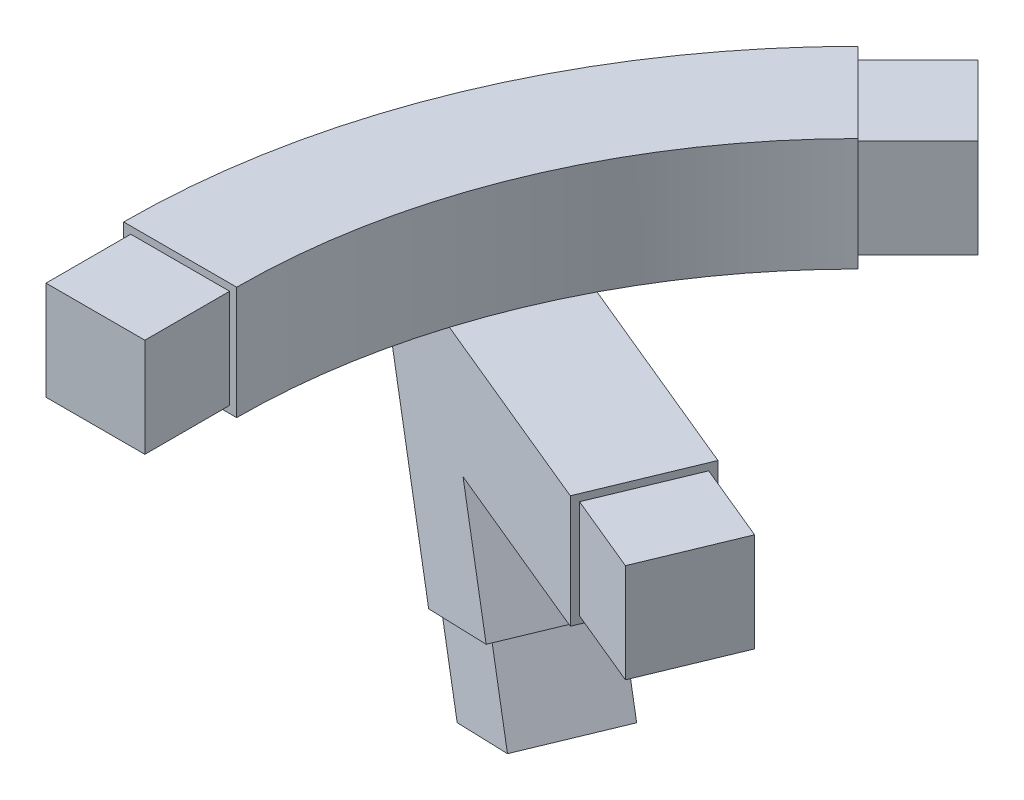
ISO-10303-21;
HEADER;
FILE_DESCRIPTION(('STEP AP214'),'2;1');
FILE_NAME('part.step','',(''),(''),'','','');
FILE_SCHEMA(('AUTOMOTIVE_DESIGN { 1 0 10303 214 1 1 1 1 }'));
ENDSEC;
DATA;
#1=APPLICATION_CONTEXT('core data for automotive mechanical design processes');
#2=APPLICATION_PROTOCOL_DEFINITION('international standard','automotive_design',2000,#1);
#3=PRODUCT_CONTEXT('',#1,'mechanical');
#4=PRODUCT('Part','Part','',(#3));
#5=PRODUCT_RELATED_PRODUCT_CATEGORY('part','',(#4));
#6=PRODUCT_DEFINITION_FORMATION('','',#4);
#7=PRODUCT_DEFINITION_CONTEXT('part definition',#1,'design');
#8=PRODUCT_DEFINITION('design','',#6,#7);
#9=PRODUCT_DEFINITION_SHAPE('','',#8);
#10=(LENGTH_UNIT() NAMED_UNIT(*) SI_UNIT(.MILLI.,.METRE.));
#11=(NAMED_UNIT(*) PLANE_ANGLE_UNIT() SI_UNIT($,.RADIAN.));
#12=(NAMED_UNIT(*) SI_UNIT($,.STERADIAN.) SOLID_ANGLE_UNIT());
#13=UNCERTAINTY_MEASURE_WITH_UNIT(LENGTH_MEASURE(1.E-05),#10,'distance_accuracy_value','');
#14=(GEOMETRIC_REPRESENTATION_CONTEXT(3) GLOBAL_UNCERTAINTY_ASSIGNED_CONTEXT((#13)) GLOBAL_UNIT_ASSIGNED_CONTEXT((#10,
#11,#12)) REPRESENTATION_CONTEXT('',''));
#15=CARTESIAN_POINT('',(0.,0.,0.));
#16=DIRECTION('',(0.,0.,1.));
#17=DIRECTION('',(1.,0.,0.));
#18=AXIS2_PLACEMENT_3D('',#15,#16,#17);
#19=CARTESIAN_POINT('',(-441.133726438275,-171.873730133986,-168.9771913672));
#20=DIRECTION('',(0.868162779195994,0.342020143325666,0.359604797490493));
#21=DIRECTION('',(0.382683432365084,0.,-0.923879532511289));
#22=AXIS2_PLACEMENT_3D('',#19,#20,#21);
#23=PLANE('',#22);
#24=CARTESIAN_POINT('',(-337.265634663522,-466.308521951962,-139.7));
#25=DIRECTION('',(0.868162779195994,0.342020143325666,0.359604797490493));
#26=DIRECTION('',(-0.315985410125161,0.939692620785909,-0.130885442385864));
#27=AXIS2_PLACEMENT_3D('',#24,#25,#26);
#28=ELLIPSE('',#27,482.720106466929,165.1);
#29=CARTESIAN_POINT('',(-484.486116716494,-14.0440282044672,-214.427101269156));
#30=VERTEX_POINT('',#29);
#31=CARTESIAN_POINT('',(-494.206275898566,-14.044028204468,-190.960561143369));
#32=VERTEX_POINT('',#31);
#33=EDGE_CURVE('E47',#30,#32,#28,.T.);
#34=ORIENTED_EDGE('',*,*,#33,.F.);
#35=DIRECTION('',(0.315985410125161,-0.939692620785909,0.130885442385864));
#36=VECTOR('',#35,1.);
#37=CARTESIAN_POINT('',(-431.413567256202,-171.873730133986,-192.443731492987));
#38=LINE('',#37,#36);
#39=CARTESIAN_POINT('',(-468.886007055742,-60.4363851359242,-207.965324273165));
#40=VERTEX_POINT('',#39);
#41=EDGE_CURVE('E219',#30,#40,#38,.T.);
#42=ORIENTED_EDGE('',*,*,#41,.T.);
#43=DIRECTION('',(0.382683432365084,0.,-0.923879532511289));
#44=VECTOR('',#43,1.);
#45=CARTESIAN_POINT('',(-478.606166237815,-60.4363851359242,-184.498784147378));
#46=LINE('',#45,#44);
#47=CARTESIAN_POINT('',(-478.606166237815,-60.4363851359242,-184.498784147378));
#48=VERTEX_POINT('',#47);
#49=EDGE_CURVE('E249',#48,#40,#46,.T.);
#50=ORIENTED_EDGE('',*,*,#49,.F.);
#51=DIRECTION('',(0.315985410125161,-0.939692620785909,0.130885442385864));
#52=VECTOR('',#51,1.);
#53=CARTESIAN_POINT('',(-441.133726438275,-171.873730133986,-168.9771913672));
#54=LINE('',#53,#52);
#55=EDGE_CURVE('E221',#32,#48,#54,.T.);
#56=ORIENTED_EDGE('',*,*,#55,.F.);
#57=EDGE_LOOP('',(#34,#42,#50,#56));
#58=FACE_BOUND('',#57,.T.);
#59=ADVANCED_FACE('F33',(#58),#23,.F.);
#60=CARTESIAN_POINT('',(4.86007959103654,0.,-11.7332700628933));
#61=DIRECTION('',(-0.382683432365084,0.,0.923879532511289));
#62=DIRECTION('',(0.923879532511289,0.,0.382683432365084));
#63=AXIS2_PLACEMENT_3D('',#60,#61,#62);
#64=PLANE('',#63);
#65=DIRECTION('',(0.,1.,0.));
#66=VECTOR('',#65,1.);
#67=CARTESIAN_POINT('',(-484.486116716494,-77.7945725843663,-214.427101269156));
#68=LINE('',#67,#66);
#69=CARTESIAN_POINT('',(-484.486116716494,0.,-214.427101269156));
#70=VERTEX_POINT('',#69);
#71=EDGE_CURVE('E11',#70,#30,#68,.F.);
#72=ORIENTED_EDGE('',*,*,#71,.F.);
#73=DIRECTION('',(0.923879532511289,0.,0.382683432365084));
#74=VECTOR('',#73,1.);
#75=CARTESIAN_POINT('',(4.86007959103654,0.,-11.7332700628933));
#76=LINE('',#75,#74);
#77=CARTESIAN_POINT('',(-460.937088807422,0.,-204.672774528516));
#78=VERTEX_POINT('',#77);
#79=EDGE_CURVE('E244',#70,#78,#76,.T.);
#80=ORIENTED_EDGE('',*,*,#79,.T.);
#81=CARTESIAN_POINT('',(-414.53844551274,0.,-185.453827200147));
#82=VERTEX_POINT('',#81);
#83=EDGE_CURVE('E238',#78,#82,#76,.T.);
#84=ORIENTED_EDGE('',*,*,#83,.T.);
#85=DIRECTION('',(0.,-1.,0.));
#86=VECTOR('',#85,1.);
#87=CARTESIAN_POINT('',(-414.53844551274,0.,-185.453827200147));
#88=LINE('',#87,#86);
#89=CARTESIAN_POINT('',(-414.53844551274,-25.4,-185.453827200147));
#90=VERTEX_POINT('',#89);
#91=EDGE_CURVE('E242',#82,#90,#88,.T.);
#92=ORIENTED_EDGE('',*,*,#91,.T.);
#93=DIRECTION('',(-0.923879532511289,0.,-0.382683432365084));
#94=VECTOR('',#93,1.);
#95=CARTESIAN_POINT('',(4.86007959103654,-25.4,-11.7332700628933));
#96=LINE('',#95,#94);
#97=CARTESIAN_POINT('',(-455.694934437824,-25.4,-202.501403092575));
#98=VERTEX_POINT('',#97);
#99=EDGE_CURVE('E523',#90,#98,#96,.T.);
#100=ORIENTED_EDGE('',*,*,#99,.T.);
#101=DIRECTION('',(0.31598541012516,-0.93969262078591,0.130885442385864));
#102=VECTOR('',#101,1.);
#103=CARTESIAN_POINT('',(-409.362232664624,-163.186418493514,-183.309769636728));
#104=LINE('',#103,#102);
#105=CARTESIAN_POINT('',(-446.834672464164,-51.7490734954523,-198.831362416906));
#106=VERTEX_POINT('',#105);
#107=EDGE_CURVE('E317',#98,#106,#104,.T.);
#108=ORIENTED_EDGE('',*,*,#107,.T.);
#109=DIRECTION('',(-0.868162779195994,-0.342020143325667,-0.359604797490493));
#110=VECTOR('',#109,1.);
#111=CARTESIAN_POINT('',(-32.6123602085032,111.437344998062,-27.2548628430718));
#112=LINE('',#111,#110);
#113=EDGE_CURVE('E237',#106,#40,#112,.T.);
#114=ORIENTED_EDGE('',*,*,#113,.T.);
#115=ORIENTED_EDGE('',*,*,#41,.F.);
#116=EDGE_LOOP('',(#72,#80,#84,#92,#100,#108,#114,#115));
#117=FACE_BOUND('',#116,.T.);
#118=ADVANCED_FACE('F234',(#117),#64,.F.);
#119=CARTESIAN_POINT('',(-4.86007959103659,0.,11.7332700628934));
#120=DIRECTION('',(-0.382683432365084,0.,0.923879532511289));
#121=DIRECTION('',(0.923879532511289,0.,0.382683432365084));
#122=AXIS2_PLACEMENT_3D('',#119,#120,#121);
#123=PLANE('',#122);
#124=DIRECTION('',(0.923879532511289,0.,0.382683432365084));
#125=VECTOR('',#124,1.);
#126=CARTESIAN_POINT('',(-4.86007959103659,0.,11.7332700628934));
#127=LINE('',#126,#125);
#128=CARTESIAN_POINT('',(-494.206275898566,0.,-190.960561143369));
#129=VERTEX_POINT('',#128);
#130=CARTESIAN_POINT('',(-470.657247989494,0.,-181.206234402729));
#131=VERTEX_POINT('',#130);
#132=EDGE_CURVE('E289',#129,#131,#127,.T.);
#133=ORIENTED_EDGE('',*,*,#132,.F.);
#134=DIRECTION('',(0.,1.,0.));
#135=VECTOR('',#134,1.);
#136=CARTESIAN_POINT('',(-494.206275898566,-77.7945725843663,-190.960561143369));
#137=LINE('',#136,#135);
#138=EDGE_CURVE('E41',#129,#32,#137,.F.);
#139=ORIENTED_EDGE('',*,*,#138,.T.);
#140=ORIENTED_EDGE('',*,*,#55,.T.);
#141=DIRECTION('',(-0.868162779195994,-0.342020143325667,-0.359604797490493));
#142=VECTOR('',#141,1.);
#143=CARTESIAN_POINT('',(-42.3325193905764,111.437344998062,-3.78832271728504));
#144=LINE('',#143,#142);
#145=CARTESIAN_POINT('',(-456.554831646237,-51.7490734954523,-175.36482229112));
#146=VERTEX_POINT('',#145);
#147=EDGE_CURVE('E250',#146,#48,#144,.T.);
#148=ORIENTED_EDGE('',*,*,#147,.F.);
#149=DIRECTION('',(0.31598541012516,-0.93969262078591,0.130885442385864));
#150=VECTOR('',#149,1.);
#151=CARTESIAN_POINT('',(-419.082391846697,-163.186418493514,-159.843229510941));
#152=LINE('',#151,#150);
#153=CARTESIAN_POINT('',(-465.415093619897,-25.4,-179.034862966788));
#154=VERTEX_POINT('',#153);
#155=EDGE_CURVE('E240',#154,#146,#152,.T.);
#156=ORIENTED_EDGE('',*,*,#155,.F.);
#157=DIRECTION('',(-0.923879532511289,0.,-0.382683432365084));
#158=VECTOR('',#157,1.);
#159=CARTESIAN_POINT('',(-4.86007959103659,-25.4,11.7332700628934));
#160=LINE('',#159,#158);
#161=CARTESIAN_POINT('',(-424.258604694813,-25.4,-161.987287074361));
#162=VERTEX_POINT('',#161);
#163=EDGE_CURVE('E306',#162,#154,#160,.T.);
#164=ORIENTED_EDGE('',*,*,#163,.F.);
#165=DIRECTION('',(0.,-1.,0.));
#166=VECTOR('',#165,1.);
#167=CARTESIAN_POINT('',(-424.258604694813,0.,-161.987287074361));
#168=LINE('',#167,#166);
#169=CARTESIAN_POINT('',(-424.258604694813,0.,-161.987287074361));
#170=VERTEX_POINT('',#169);
#171=EDGE_CURVE('E301',#170,#162,#168,.T.);
#172=ORIENTED_EDGE('',*,*,#171,.F.);
#173=EDGE_CURVE('E295',#131,#170,#127,.T.);
#174=ORIENTED_EDGE('',*,*,#173,.F.);
#175=EDGE_LOOP('',(#133,#139,#140,#148,#156,#164,#172,#174));
#176=FACE_BOUND('',#175,.T.);
#177=ADVANCED_FACE('F457',(#176),#123,.T.);
#178=CARTESIAN_POINT('',(-42.3325193905764,111.437344998062,-3.78832271728504));
#179=DIRECTION('',(0.315985410125161,-0.939692620785909,0.130885442385864));
#180=DIRECTION('',(0.947846471025611,0.318727261721203,0.));
#181=AXIS2_PLACEMENT_3D('',#178,#179,#180);
#182=PLANE('',#181);
#183=ORIENTED_EDGE('',*,*,#113,.F.);
#184=DIRECTION('',(0.382683432365084,0.,-0.923879532511289));
#185=VECTOR('',#184,1.);
#186=CARTESIAN_POINT('',(-456.554831646237,-51.7490734954523,-175.36482229112));
#187=LINE('',#186,#185);
#188=EDGE_CURVE('E247',#146,#106,#187,.T.);
#189=ORIENTED_EDGE('',*,*,#188,.F.);
#190=ORIENTED_EDGE('',*,*,#147,.T.);
#191=ORIENTED_EDGE('',*,*,#49,.T.);
#192=EDGE_LOOP('',(#183,#189,#190,#191));
#193=FACE_BOUND('',#192,.T.);
#194=DIRECTION('',(0.382683432365085,0.,-0.923879532511289));
#195=VECTOR('',#194,1.);
#196=CARTESIAN_POINT('',(-476.620447876962,-59.8934281583947,-185.394570289224));
#197=LINE('',#196,#195);
#198=CARTESIAN_POINT('',(-476.620447876962,-59.8934281583947,-185.394570289224));
#199=VERTEX_POINT('',#198);
#200=CARTESIAN_POINT('',(-468.115308592648,-59.8934281583947,-205.927792899287));
#201=VERTEX_POINT('',#200);
#202=EDGE_CURVE('E425',#199,#201,#197,.T.);
#203=ORIENTED_EDGE('',*,*,#202,.F.);
#204=DIRECTION('',(-0.868162779195994,-0.342020143325666,-0.359604797490492));
#205=VECTOR('',#204,1.);
#206=CARTESIAN_POINT('',(-457.325530109331,-52.2920304729818,-177.402353664998));
#207=LINE('',#206,#205);
#208=CARTESIAN_POINT('',(-457.325530109331,-52.2920304729818,-177.402353664998));
#209=VERTEX_POINT('',#208);
#210=EDGE_CURVE('E222',#209,#199,#207,.T.);
#211=ORIENTED_EDGE('',*,*,#210,.F.);
#212=DIRECTION('',(-0.382683432365085,0.,0.923879532511289));
#213=VECTOR('',#212,1.);
#214=CARTESIAN_POINT('',(-448.820390825017,-52.2920304729818,-197.935576275061));
#215=LINE('',#214,#213);
#216=CARTESIAN_POINT('',(-448.820390825017,-52.2920304729818,-197.935576275061));
#217=VERTEX_POINT('',#216);
#218=EDGE_CURVE('E420',#217,#209,#215,.T.);
#219=ORIENTED_EDGE('',*,*,#218,.F.);
#220=DIRECTION('',(0.868162779195994,0.342020143325667,0.359604797490492));
#221=VECTOR('',#220,1.);
#222=CARTESIAN_POINT('',(-468.115308592648,-59.8934281583947,-205.927792899287));
#223=LINE('',#222,#221);
#224=EDGE_CURVE('E423',#201,#217,#223,.T.);
#225=ORIENTED_EDGE('',*,*,#224,.F.);
#226=EDGE_LOOP('',(#203,#211,#219,#225));
#227=FACE_BOUND('',#226,.T.);
#228=ADVANCED_FACE('F454',(#193,#227),#182,.T.);
#229=CARTESIAN_POINT('',(-424.258604694813,0.,-161.987287074361));
#230=DIRECTION('',(0.923879532511289,0.,0.382683432365084));
#231=DIRECTION('',(0.382683432365084,0.,-0.923879532511289));
#232=AXIS2_PLACEMENT_3D('',#229,#230,#231);
#233=PLANE('',#232);
#234=ORIENTED_EDGE('',*,*,#91,.F.);
#235=DIRECTION('',(0.382683432365084,0.,-0.923879532511289));
#236=VECTOR('',#235,1.);
#237=CARTESIAN_POINT('',(-424.258604694813,0.,-161.987287074361));
#238=LINE('',#237,#236);
#239=EDGE_CURVE('E252',#170,#82,#238,.T.);
#240=ORIENTED_EDGE('',*,*,#239,.F.);
#241=ORIENTED_EDGE('',*,*,#171,.T.);
#242=DIRECTION('',(0.382683432365084,0.,-0.923879532511289));
#243=VECTOR('',#242,1.);
#244=CARTESIAN_POINT('',(-424.258604694813,-25.4,-161.987287074361));
#245=LINE('',#244,#243);
#246=EDGE_CURVE('E255',#162,#90,#245,.T.);
#247=ORIENTED_EDGE('',*,*,#246,.T.);
#248=EDGE_LOOP('',(#234,#240,#241,#247));
#249=FACE_BOUND('',#248,.T.);
#250=DIRECTION('',(-0.382683432365084,0.,0.923879532511289));
#251=VECTOR('',#250,1.);
#252=CARTESIAN_POINT('',(-423.651094745933,-1.58749999999999,-163.453945832222));
#253=LINE('',#252,#251);
#254=CARTESIAN_POINT('',(-415.145955461619,-1.58749999999999,-183.987168442286));
#255=VERTEX_POINT('',#254);
#256=CARTESIAN_POINT('',(-423.651094745933,-1.58749999999999,-163.453945832222));
#257=VERTEX_POINT('',#256);
#258=EDGE_CURVE('E398',#255,#257,#253,.T.);
#259=ORIENTED_EDGE('',*,*,#258,.F.);
#260=DIRECTION('',(0.,1.,0.));
#261=VECTOR('',#260,1.);
#262=CARTESIAN_POINT('',(-415.145955461619,-23.8125,-183.987168442286));
#263=LINE('',#262,#261);
#264=CARTESIAN_POINT('',(-415.145955461619,-23.8125,-183.987168442286));
#265=VERTEX_POINT('',#264);
#266=EDGE_CURVE('E400',#265,#255,#263,.T.);
#267=ORIENTED_EDGE('',*,*,#266,.F.);
#268=DIRECTION('',(0.382683432365084,0.,-0.923879532511289));
#269=VECTOR('',#268,1.);
#270=CARTESIAN_POINT('',(-423.651094745933,-23.8125,-163.453945832222));
#271=LINE('',#270,#269);
#272=CARTESIAN_POINT('',(-423.651094745933,-23.8125,-163.453945832222));
#273=VERTEX_POINT('',#272);
#274=EDGE_CURVE('E392',#273,#265,#271,.T.);
#275=ORIENTED_EDGE('',*,*,#274,.F.);
#276=DIRECTION('',(0.,-1.,0.));
#277=VECTOR('',#276,1.);
#278=CARTESIAN_POINT('',(-423.651094745933,-23.8125,-163.453945832222));
#279=LINE('',#278,#277);
#280=EDGE_CURVE('E395',#257,#273,#279,.T.);
#281=ORIENTED_EDGE('',*,*,#280,.F.);
#282=EDGE_LOOP('',(#259,#267,#275,#281));
#283=FACE_BOUND('',#282,.T.);
#284=ADVANCED_FACE('F456',(#249,#283),#233,.T.);
#285=CARTESIAN_POINT('',(-98.7828173317688,25.4,98.7828173317651));
#286=DIRECTION('',(-0.707106781186561,0.,0.707106781186534));
#287=DIRECTION('',(0.707106781186534,0.,0.707106781186561));
#288=AXIS2_PLACEMENT_3D('',#285,#286,#287);
#289=PLANE('',#288);
#290=DIRECTION('',(-0.707106781186534,0.,-0.707106781186561));
#291=VECTOR('',#290,1.);
#292=CARTESIAN_POINT('',(-98.7828173317688,0.,98.7828173317651));
#293=LINE('',#292,#291);
#294=CARTESIAN_POINT('',(-436.048451995282,0.,-238.482817331761));
#295=VERTEX_POINT('',#294);
#296=CARTESIAN_POINT('',(-454.00896423742,0.,-256.4433295739));
#297=VERTEX_POINT('',#296);
#298=EDGE_CURVE('E276',#295,#297,#293,.T.);
#299=ORIENTED_EDGE('',*,*,#298,.T.);
#300=DIRECTION('',(0.,-1.,0.));
#301=VECTOR('',#300,1.);
#302=CARTESIAN_POINT('',(-454.00896423742,25.4,-256.4433295739));
#303=LINE('',#302,#301);
#304=CARTESIAN_POINT('',(-454.00896423742,25.4,-256.4433295739));
#305=VERTEX_POINT('',#304);
#306=EDGE_CURVE('E283',#305,#297,#303,.T.);
#307=ORIENTED_EDGE('',*,*,#306,.F.);
#308=DIRECTION('',(-0.707106781186534,0.,-0.707106781186561));
#309=VECTOR('',#308,1.);
#310=CARTESIAN_POINT('',(-98.7828173317688,25.4,98.7828173317651));
#311=LINE('',#310,#309);
#312=CARTESIAN_POINT('',(-436.048451995282,25.4,-238.482817331761));
#313=VERTEX_POINT('',#312);
#314=EDGE_CURVE('E265',#313,#305,#311,.T.);
#315=ORIENTED_EDGE('',*,*,#314,.F.);
#316=DIRECTION('',(0.,-1.,0.));
#317=VECTOR('',#316,1.);
#318=CARTESIAN_POINT('',(-436.048451995282,25.4,-238.482817331761));
#319=LINE('',#318,#317);
#320=EDGE_CURVE('E285',#313,#295,#319,.T.);
#321=ORIENTED_EDGE('',*,*,#320,.T.);
#322=EDGE_LOOP('',(#299,#307,#315,#321));
#323=FACE_BOUND('',#322,.T.);
#324=DIRECTION('',(0.,1.,0.));
#325=VECTOR('',#324,1.);
#326=CARTESIAN_POINT('',(-452.886432222287,23.8125,-255.320797558766));
#327=LINE('',#326,#325);
#328=CARTESIAN_POINT('',(-452.886432222287,1.5875,-255.320797558766));
#329=VERTEX_POINT('',#328);
#330=CARTESIAN_POINT('',(-452.886432222287,23.8125,-255.320797558766));
#331=VERTEX_POINT('',#330);
#332=EDGE_CURVE('E371',#329,#331,#327,.T.);
#333=ORIENTED_EDGE('',*,*,#332,.F.);
#334=DIRECTION('',(-0.707106781186533,0.,-0.707106781186563));
#335=VECTOR('',#334,1.);
#336=CARTESIAN_POINT('',(-437.170984010416,1.5875,-239.605349346895));
#337=LINE('',#336,#335);
#338=CARTESIAN_POINT('',(-437.170984010416,1.5875,-239.605349346895));
#339=VERTEX_POINT('',#338);
#340=EDGE_CURVE('E361',#339,#329,#337,.T.);
#341=ORIENTED_EDGE('',*,*,#340,.F.);
#342=DIRECTION('',(0.,-1.,0.));
#343=VECTOR('',#342,1.);
#344=CARTESIAN_POINT('',(-437.170984010416,23.8125,-239.605349346895));
#345=LINE('',#344,#343);
#346=CARTESIAN_POINT('',(-437.170984010416,23.8125,-239.605349346895));
#347=VERTEX_POINT('',#346);
#348=EDGE_CURVE('E365',#347,#339,#345,.T.);
#349=ORIENTED_EDGE('',*,*,#348,.F.);
#350=DIRECTION('',(0.707106781186533,0.,0.707106781186563));
#351=VECTOR('',#350,1.);
#352=CARTESIAN_POINT('',(-437.170984010416,23.8125,-239.605349346895));
#353=LINE('',#352,#351);
#354=EDGE_CURVE('E368',#331,#347,#353,.T.);
#355=ORIENTED_EDGE('',*,*,#354,.F.);
#356=EDGE_LOOP('',(#333,#341,#349,#355));
#357=FACE_BOUND('',#356,.T.);
#358=ADVANCED_FACE('F464',(#323,#357),#289,.F.);
#359=CARTESIAN_POINT('',(-4.42701431069331E-12,25.4,-139.700000000015));
#360=DIRECTION('',(0.,0.,-1.));
#361=DIRECTION('',(-1.,0.,0.));
#362=AXIS2_PLACEMENT_3D('',#359,#360,#361);
#363=PLANE('',#362);
#364=DIRECTION('',(1.,0.,0.));
#365=VECTOR('',#364,1.);
#366=CARTESIAN_POINT('',(-4.42701431069331E-12,0.,-139.700000000015));
#367=LINE('',#366,#365);
#368=CARTESIAN_POINT('',(-502.365634663522,0.,-139.7));
#369=VERTEX_POINT('',#368);
#370=CARTESIAN_POINT('',(-476.965634663522,0.,-139.7));
#371=VERTEX_POINT('',#370);
#372=EDGE_CURVE('E259',#369,#371,#367,.T.);
#373=ORIENTED_EDGE('',*,*,#372,.T.);
#374=DIRECTION('',(0.,-1.,0.));
#375=VECTOR('',#374,1.);
#376=CARTESIAN_POINT('',(-476.965634663522,25.4,-139.7));
#377=LINE('',#376,#375);
#378=CARTESIAN_POINT('',(-476.965634663522,25.4,-139.7));
#379=VERTEX_POINT('',#378);
#380=EDGE_CURVE('E287',#379,#371,#377,.T.);
#381=ORIENTED_EDGE('',*,*,#380,.F.);
#382=DIRECTION('',(1.,0.,0.));
#383=VECTOR('',#382,1.);
#384=CARTESIAN_POINT('',(-4.42701431069331E-12,25.4,-139.700000000015));
#385=LINE('',#384,#383);
#386=CARTESIAN_POINT('',(-502.365634663522,25.4,-139.7));
#387=VERTEX_POINT('',#386);
#388=EDGE_CURVE('E260',#387,#379,#385,.T.);
#389=ORIENTED_EDGE('',*,*,#388,.F.);
#390=DIRECTION('',(0.,-1.,0.));
#391=VECTOR('',#390,1.);
#392=CARTESIAN_POINT('',(-502.365634663522,25.4,-139.7));
#393=LINE('',#392,#391);
#394=EDGE_CURVE('E269',#387,#369,#393,.T.);
#395=ORIENTED_EDGE('',*,*,#394,.T.);
#396=EDGE_LOOP('',(#373,#381,#389,#395));
#397=FACE_BOUND('',#396,.T.);
#398=DIRECTION('',(0.,1.,0.));
#399=VECTOR('',#398,1.);
#400=CARTESIAN_POINT('',(-478.553134663522,1.5875,-139.700000000015));
#401=LINE('',#400,#399);
#402=CARTESIAN_POINT('',(-478.553134663522,1.5875,-139.700000000015));
#403=VERTEX_POINT('',#402);
#404=CARTESIAN_POINT('',(-478.553134663522,23.8125,-139.7));
#405=VERTEX_POINT('',#404);
#406=EDGE_CURVE('E338',#403,#405,#401,.T.);
#407=ORIENTED_EDGE('',*,*,#406,.F.);
#408=DIRECTION('',(1.,0.,0.));
#409=VECTOR('',#408,1.);
#410=CARTESIAN_POINT('',(-500.778134663522,1.5875,-139.700000000015));
#411=LINE('',#410,#409);
#412=CARTESIAN_POINT('',(-500.778134663522,1.5875,-139.7));
#413=VERTEX_POINT('',#412);
#414=EDGE_CURVE('E328',#413,#403,#411,.T.);
#415=ORIENTED_EDGE('',*,*,#414,.F.);
#416=DIRECTION('',(0.,-1.,0.));
#417=VECTOR('',#416,1.);
#418=CARTESIAN_POINT('',(-500.778134663522,1.5875,-139.700000000015));
#419=LINE('',#418,#417);
#420=CARTESIAN_POINT('',(-500.778134663522,23.8125,-139.7));
#421=VERTEX_POINT('',#420);
#422=EDGE_CURVE('E332',#421,#413,#419,.T.);
#423=ORIENTED_EDGE('',*,*,#422,.F.);
#424=DIRECTION('',(-1.,0.,0.));
#425=VECTOR('',#424,1.);
#426=CARTESIAN_POINT('',(-500.778134663522,23.8125,-139.700000000015));
#427=LINE('',#426,#425);
#428=EDGE_CURVE('E335',#405,#421,#427,.T.);
#429=ORIENTED_EDGE('',*,*,#428,.F.);
#430=EDGE_LOOP('',(#407,#415,#423,#429));
#431=FACE_BOUND('',#430,.T.);
#432=ADVANCED_FACE('F35',(#397,#431),#363,.F.);
#433=CARTESIAN_POINT('',(0.,0.,0.));
#434=DIRECTION('',(0.,1.,0.));
#435=DIRECTION('',(0.,0.,1.));
#436=AXIS2_PLACEMENT_3D('',#433,#434,#435);
#437=PLANE('',#436);
#438=ORIENTED_EDGE('',*,*,#79,.F.);
#439=CARTESIAN_POINT('',(-337.265634663522,0.,-139.7));
#440=DIRECTION('',(0.,1.,0.));
#441=DIRECTION('',(0.,0.,1.));
#442=AXIS2_PLACEMENT_3D('',#439,#440,#441);
#443=CIRCLE('',#442,165.1);
#444=EDGE_CURVE('E229',#297,#70,#443,.T.);
#445=ORIENTED_EDGE('',*,*,#444,.F.);
#446=ORIENTED_EDGE('',*,*,#298,.F.);
#447=CARTESIAN_POINT('',(-337.265634663522,0.,-139.7));
#448=DIRECTION('',(0.,1.,0.));
#449=DIRECTION('',(0.,0.,1.));
#450=AXIS2_PLACEMENT_3D('',#447,#448,#449);
#451=CIRCLE('',#450,139.7);
#452=EDGE_CURVE('E273',#295,#78,#451,.T.);
#453=ORIENTED_EDGE('',*,*,#452,.T.);
#454=EDGE_LOOP('',(#438,#445,#446,#453));
#455=FACE_BOUND('',#454,.T.);
#456=ADVANCED_FACE('F494',(#455),#437,.F.);
#457=CARTESIAN_POINT('',(-337.265634663522,25.4,-139.7));
#458=DIRECTION('',(0.,-1.,0.));
#459=DIRECTION('',(0.,0.,-1.));
#460=AXIS2_PLACEMENT_3D('',#457,#458,#459);
#461=CYLINDRICAL_SURFACE('',#460,139.7);
#462=ORIENTED_EDGE('',*,*,#452,.F.);
#463=ORIENTED_EDGE('',*,*,#320,.F.);
#464=CARTESIAN_POINT('',(-337.265634663522,25.4,-139.7));
#465=DIRECTION('',(0.,1.,0.));
#466=DIRECTION('',(0.,0.,1.));
#467=AXIS2_PLACEMENT_3D('',#464,#465,#466);
#468=CIRCLE('',#467,139.7);
#469=EDGE_CURVE('E262',#313,#379,#468,.T.);
#470=ORIENTED_EDGE('',*,*,#469,.T.);
#471=ORIENTED_EDGE('',*,*,#380,.T.);
#472=EDGE_CURVE('E272',#131,#371,#451,.T.);
#473=ORIENTED_EDGE('',*,*,#472,.F.);
#474=EDGE_CURVE('E277',#78,#131,#451,.T.);
#475=ORIENTED_EDGE('',*,*,#474,.F.);
#476=EDGE_LOOP('',(#462,#463,#470,#471,#473,#475));
#477=FACE_BOUND('',#476,.T.);
#478=ADVANCED_FACE('F497',(#477),#461,.F.);
#479=CARTESIAN_POINT('',(-337.265634663522,25.4,-139.7));
#480=DIRECTION('',(0.,-1.,0.));
#481=DIRECTION('',(0.,0.,-1.));
#482=AXIS2_PLACEMENT_3D('',#479,#480,#481);
#483=CYLINDRICAL_SURFACE('',#482,165.1);
#484=ORIENTED_EDGE('',*,*,#394,.F.);
#485=CARTESIAN_POINT('',(-337.265634663522,25.4,-139.7));
#486=DIRECTION('',(0.,1.,0.));
#487=DIRECTION('',(0.,0.,1.));
#488=AXIS2_PLACEMENT_3D('',#485,#486,#487);
#489=CIRCLE('',#488,165.1);
#490=EDGE_CURVE('E267',#305,#387,#489,.T.);
#491=ORIENTED_EDGE('',*,*,#490,.F.);
#492=ORIENTED_EDGE('',*,*,#306,.T.);
#493=ORIENTED_EDGE('',*,*,#444,.T.);
#494=ORIENTED_EDGE('',*,*,#71,.T.);
#495=ORIENTED_EDGE('',*,*,#33,.T.);
#496=ORIENTED_EDGE('',*,*,#138,.F.);
#497=EDGE_CURVE('E279',#129,#369,#443,.T.);
#498=ORIENTED_EDGE('',*,*,#497,.T.);
#499=EDGE_LOOP('',(#484,#491,#492,#493,#494,#495,#496,#498));
#500=FACE_BOUND('',#499,.T.);
#501=ADVANCED_FACE('F226',(#500),#483,.T.);
#502=CARTESIAN_POINT('',(0.,25.4,0.));
#503=DIRECTION('',(0.,1.,0.));
#504=DIRECTION('',(0.,0.,1.));
#505=AXIS2_PLACEMENT_3D('',#502,#503,#504);
#506=PLANE('',#505);
#507=ORIENTED_EDGE('',*,*,#388,.T.);
#508=ORIENTED_EDGE('',*,*,#469,.F.);
#509=ORIENTED_EDGE('',*,*,#314,.T.);
#510=ORIENTED_EDGE('',*,*,#490,.T.);
#511=EDGE_LOOP('',(#507,#508,#509,#510));
#512=FACE_BOUND('',#511,.T.);
#513=ADVANCED_FACE('F488',(#512),#506,.T.);
#514=ORIENTED_EDGE('',*,*,#497,.F.);
#515=ORIENTED_EDGE('',*,*,#132,.T.);
#516=ORIENTED_EDGE('',*,*,#472,.T.);
#517=ORIENTED_EDGE('',*,*,#372,.F.);
#518=EDGE_LOOP('',(#514,#515,#516,#517));
#519=FACE_BOUND('',#518,.T.);
#520=ADVANCED_FACE('F486',(#519),#437,.F.);
#521=CARTESIAN_POINT('',(-419.082391846697,-163.186418493514,-159.843229510941));
#522=DIRECTION('',(0.868162779195994,0.342020143325666,0.359604797490493));
#523=DIRECTION('',(0.382683432365084,0.,-0.923879532511289));
#524=AXIS2_PLACEMENT_3D('',#521,#522,#523);
#525=PLANE('',#524);
#526=ORIENTED_EDGE('',*,*,#107,.F.);
#527=DIRECTION('',(0.382683432365084,0.,-0.923879532511289));
#528=VECTOR('',#527,1.);
#529=CARTESIAN_POINT('',(-465.415093619897,-25.4,-179.034862966788));
#530=LINE('',#529,#528);
#531=EDGE_CURVE('E257',#154,#98,#530,.T.);
#532=ORIENTED_EDGE('',*,*,#531,.F.);
#533=ORIENTED_EDGE('',*,*,#155,.T.);
#534=ORIENTED_EDGE('',*,*,#188,.T.);
#535=EDGE_LOOP('',(#526,#532,#533,#534));
#536=FACE_BOUND('',#535,.T.);
#537=ADVANCED_FACE('F482',(#536),#525,.T.);
#538=CARTESIAN_POINT('',(-4.86007959103659,-25.4,11.7332700628934));
#539=DIRECTION('',(0.,-1.,0.));
#540=DIRECTION('',(0.,0.,-1.));
#541=AXIS2_PLACEMENT_3D('',#538,#539,#540);
#542=PLANE('',#541);
#543=ORIENTED_EDGE('',*,*,#99,.F.);
#544=ORIENTED_EDGE('',*,*,#246,.F.);
#545=ORIENTED_EDGE('',*,*,#163,.T.);
#546=ORIENTED_EDGE('',*,*,#531,.T.);
#547=EDGE_LOOP('',(#543,#544,#545,#546));
#548=FACE_BOUND('',#547,.T.);
#549=ADVANCED_FACE('F478',(#548),#542,.T.);
#550=CARTESIAN_POINT('',(-4.86007959103659,0.,11.7332700628934));
#551=DIRECTION('',(0.,1.,0.));
#552=DIRECTION('',(0.,0.,1.));
#553=AXIS2_PLACEMENT_3D('',#550,#551,#552);
#554=PLANE('',#553);
#555=ORIENTED_EDGE('',*,*,#83,.F.);
#556=ORIENTED_EDGE('',*,*,#474,.T.);
#557=ORIENTED_EDGE('',*,*,#173,.T.);
#558=ORIENTED_EDGE('',*,*,#239,.T.);
#559=EDGE_LOOP('',(#555,#556,#557,#558));
#560=FACE_BOUND('',#559,.T.);
#561=ADVANCED_FACE('F475',(#560),#554,.T.);
#562=CARTESIAN_POINT('',(-478.553134663522,1.5875,-120.650000000015));
#563=DIRECTION('',(-1.,0.,0.));
#564=DIRECTION('',(0.,0.,1.));
#565=AXIS2_PLACEMENT_3D('',#562,#563,#564);
#566=PLANE('',#565);
#567=ORIENTED_EDGE('',*,*,#406,.T.);
#568=DIRECTION('',(0.,0.,-1.));
#569=VECTOR('',#568,1.);
#570=CARTESIAN_POINT('',(-478.553134663522,23.8125,-120.650000000015));
#571=LINE('',#570,#569);
#572=CARTESIAN_POINT('',(-478.553134663522,23.8125,-120.650000000015));
#573=VERTEX_POINT('',#572);
#574=EDGE_CURVE('E314',#573,#405,#571,.T.);
#575=ORIENTED_EDGE('',*,*,#574,.F.);
#576=DIRECTION('',(0.,1.,0.));
#577=VECTOR('',#576,1.);
#578=CARTESIAN_POINT('',(-478.553134663522,1.5875,-120.650000000015));
#579=LINE('',#578,#577);
#580=CARTESIAN_POINT('',(-478.553134663522,1.5875,-120.650000000015));
#581=VERTEX_POINT('',#580);
#582=EDGE_CURVE('E331',#581,#573,#579,.T.);
#583=ORIENTED_EDGE('',*,*,#582,.F.);
#584=DIRECTION('',(0.,0.,-1.));
#585=VECTOR('',#584,1.);
#586=CARTESIAN_POINT('',(-478.553134663522,1.5875,-120.650000000015));
#587=LINE('',#586,#585);
#588=EDGE_CURVE('E324',#581,#403,#587,.T.);
#589=ORIENTED_EDGE('',*,*,#588,.T.);
#590=EDGE_LOOP('',(#567,#575,#583,#589));
#591=FACE_BOUND('',#590,.T.);
#592=ADVANCED_FACE('F477',(#591),#566,.F.);
#593=CARTESIAN_POINT('',(-500.778134663522,23.8125,-120.650000000015));
#594=DIRECTION('',(0.,-1.,0.));
#595=DIRECTION('',(0.,0.,-1.));
#596=AXIS2_PLACEMENT_3D('',#593,#594,#595);
#597=PLANE('',#596);
#598=ORIENTED_EDGE('',*,*,#428,.T.);
#599=DIRECTION('',(0.,0.,-1.));
#600=VECTOR('',#599,1.);
#601=CARTESIAN_POINT('',(-500.778134663522,23.8125,-120.650000000015));
#602=LINE('',#601,#600);
#603=CARTESIAN_POINT('',(-500.778134663522,23.8125,-120.650000000015));
#604=VERTEX_POINT('',#603);
#605=EDGE_CURVE('E318',#604,#421,#602,.T.);
#606=ORIENTED_EDGE('',*,*,#605,.F.);
#607=DIRECTION('',(-1.,0.,0.));
#608=VECTOR('',#607,1.);
#609=CARTESIAN_POINT('',(-500.778134663522,23.8125,-120.650000000015));
#610=LINE('',#609,#608);
#611=EDGE_CURVE('E345',#573,#604,#610,.T.);
#612=ORIENTED_EDGE('',*,*,#611,.F.);
#613=ORIENTED_EDGE('',*,*,#574,.T.);
#614=EDGE_LOOP('',(#598,#606,#612,#613));
#615=FACE_BOUND('',#614,.T.);
#616=ADVANCED_FACE('F599',(#615),#597,.F.);
#617=CARTESIAN_POINT('',(-500.778134663522,1.5875,-120.650000000015));
#618=DIRECTION('',(1.,0.,0.));
#619=DIRECTION('',(0.,0.,-1.));
#620=AXIS2_PLACEMENT_3D('',#617,#618,#619);
#621=PLANE('',#620);
#622=ORIENTED_EDGE('',*,*,#422,.T.);
#623=DIRECTION('',(0.,0.,-1.));
#624=VECTOR('',#623,1.);
#625=CARTESIAN_POINT('',(-500.778134663522,1.5875,-120.650000000015));
#626=LINE('',#625,#624);
#627=CARTESIAN_POINT('',(-500.778134663522,1.5875,-120.650000000015));
#628=VERTEX_POINT('',#627);
#629=EDGE_CURVE('E321',#628,#413,#626,.T.);
#630=ORIENTED_EDGE('',*,*,#629,.F.);
#631=DIRECTION('',(0.,-1.,0.));
#632=VECTOR('',#631,1.);
#633=CARTESIAN_POINT('',(-500.778134663522,1.5875,-120.650000000015));
#634=LINE('',#633,#632);
#635=EDGE_CURVE('E343',#604,#628,#634,.T.);
#636=ORIENTED_EDGE('',*,*,#635,.F.);
#637=ORIENTED_EDGE('',*,*,#605,.T.);
#638=EDGE_LOOP('',(#622,#630,#636,#637));
#639=FACE_BOUND('',#638,.T.);
#640=ADVANCED_FACE('F595',(#639),#621,.F.);
#641=CARTESIAN_POINT('',(-500.778134663522,1.5875,-120.650000000015));
#642=DIRECTION('',(0.,1.,0.));
#643=DIRECTION('',(0.,0.,1.));
#644=AXIS2_PLACEMENT_3D('',#641,#642,#643);
#645=PLANE('',#644);
#646=ORIENTED_EDGE('',*,*,#414,.T.);
#647=ORIENTED_EDGE('',*,*,#588,.F.);
#648=DIRECTION('',(1.,0.,0.));
#649=VECTOR('',#648,1.);
#650=CARTESIAN_POINT('',(-500.778134663522,1.5875,-120.650000000015));
#651=LINE('',#650,#649);
#652=EDGE_CURVE('E327',#628,#581,#651,.T.);
#653=ORIENTED_EDGE('',*,*,#652,.F.);
#654=ORIENTED_EDGE('',*,*,#629,.T.);
#655=EDGE_LOOP('',(#646,#647,#653,#654));
#656=FACE_BOUND('',#655,.T.);
#657=ADVANCED_FACE('F591',(#656),#645,.F.);
#658=CARTESIAN_POINT('',(0.,0.,-120.650000000015));
#659=DIRECTION('',(0.,0.,-1.));
#660=DIRECTION('',(-1.,0.,0.));
#661=AXIS2_PLACEMENT_3D('',#658,#659,#660);
#662=PLANE('',#661);
#663=ORIENTED_EDGE('',*,*,#582,.T.);
#664=ORIENTED_EDGE('',*,*,#611,.T.);
#665=ORIENTED_EDGE('',*,*,#635,.T.);
#666=ORIENTED_EDGE('',*,*,#652,.T.);
#667=EDGE_LOOP('',(#663,#664,#665,#666));
#668=FACE_BOUND('',#667,.T.);
#669=ADVANCED_FACE('F587',(#668),#662,.F.);
#670=CARTESIAN_POINT('',(-439.416048040683,23.8125,-268.79118174037));
#671=DIRECTION('',(0.707106781186534,0.,0.707106781186561));
#672=DIRECTION('',(0.707106781186561,0.,-0.707106781186534));
#673=AXIS2_PLACEMENT_3D('',#670,#671,#672);
#674=PLANE('',#673);
#675=ORIENTED_EDGE('',*,*,#332,.T.);
#676=DIRECTION('',(-0.707106781186561,0.,0.707106781186534));
#677=VECTOR('',#676,1.);
#678=CARTESIAN_POINT('',(-439.416048040683,23.8125,-268.79118174037));
#679=LINE('',#678,#677);
#680=CARTESIAN_POINT('',(-439.416048040683,23.8125,-268.79118174037));
#681=VERTEX_POINT('',#680);
#682=EDGE_CURVE('E341',#681,#331,#679,.T.);
#683=ORIENTED_EDGE('',*,*,#682,.F.);
#684=DIRECTION('',(0.,1.,0.));
#685=VECTOR('',#684,1.);
#686=CARTESIAN_POINT('',(-439.416048040683,23.8125,-268.79118174037));
#687=LINE('',#686,#685);
#688=CARTESIAN_POINT('',(-439.416048040683,1.5875,-268.79118174037));
#689=VERTEX_POINT('',#688);
#690=EDGE_CURVE('E364',#689,#681,#687,.T.);
#691=ORIENTED_EDGE('',*,*,#690,.F.);
#692=DIRECTION('',(-0.707106781186561,0.,0.707106781186534));
#693=VECTOR('',#692,1.);
#694=CARTESIAN_POINT('',(-439.416048040683,1.5875,-268.79118174037));
#695=LINE('',#694,#693);
#696=EDGE_CURVE('E357',#689,#329,#695,.T.);
#697=ORIENTED_EDGE('',*,*,#696,.T.);
#698=EDGE_LOOP('',(#675,#683,#691,#697));
#699=FACE_BOUND('',#698,.T.);
#700=ADVANCED_FACE('F583',(#699),#674,.F.);
#701=CARTESIAN_POINT('',(-423.700599828812,23.8125,-253.075733528498));
#702=DIRECTION('',(0.,-1.,0.));
#703=DIRECTION('',(0.,0.,-1.));
#704=AXIS2_PLACEMENT_3D('',#701,#702,#703);
#705=PLANE('',#704);
#706=ORIENTED_EDGE('',*,*,#354,.T.);
#707=DIRECTION('',(-0.707106781186561,0.,0.707106781186534));
#708=VECTOR('',#707,1.);
#709=CARTESIAN_POINT('',(-423.700599828812,23.8125,-253.075733528498));
#710=LINE('',#709,#708);
#711=CARTESIAN_POINT('',(-423.700599828812,23.8125,-253.075733528498));
#712=VERTEX_POINT('',#711);
#713=EDGE_CURVE('E351',#712,#347,#710,.T.);
#714=ORIENTED_EDGE('',*,*,#713,.F.);
#715=DIRECTION('',(0.707106781186533,0.,0.707106781186563));
#716=VECTOR('',#715,1.);
#717=CARTESIAN_POINT('',(-423.700599828812,23.8125,-253.075733528498));
#718=LINE('',#717,#716);
#719=EDGE_CURVE('E378',#681,#712,#718,.T.);
#720=ORIENTED_EDGE('',*,*,#719,.F.);
#721=ORIENTED_EDGE('',*,*,#682,.T.);
#722=EDGE_LOOP('',(#706,#714,#720,#721));
#723=FACE_BOUND('',#722,.T.);
#724=ADVANCED_FACE('F579',(#723),#705,.F.);
#725=CARTESIAN_POINT('',(-423.700599828812,23.8125,-253.075733528498));
#726=DIRECTION('',(-0.707106781186534,0.,-0.707106781186561));
#727=DIRECTION('',(-0.707106781186561,0.,0.707106781186534));
#728=AXIS2_PLACEMENT_3D('',#725,#726,#727);
#729=PLANE('',#728);
#730=ORIENTED_EDGE('',*,*,#348,.T.);
#731=DIRECTION('',(-0.707106781186561,0.,0.707106781186534));
#732=VECTOR('',#731,1.);
#733=CARTESIAN_POINT('',(-423.700599828812,1.5875,-253.075733528498));
#734=LINE('',#733,#732);
#735=CARTESIAN_POINT('',(-423.700599828812,1.5875,-253.075733528498));
#736=VERTEX_POINT('',#735);
#737=EDGE_CURVE('E354',#736,#339,#734,.T.);
#738=ORIENTED_EDGE('',*,*,#737,.F.);
#739=DIRECTION('',(0.,-1.,0.));
#740=VECTOR('',#739,1.);
#741=CARTESIAN_POINT('',(-423.700599828812,23.8125,-253.075733528498));
#742=LINE('',#741,#740);
#743=EDGE_CURVE('E376',#712,#736,#742,.T.);
#744=ORIENTED_EDGE('',*,*,#743,.F.);
#745=ORIENTED_EDGE('',*,*,#713,.T.);
#746=EDGE_LOOP('',(#730,#738,#744,#745));
#747=FACE_BOUND('',#746,.T.);
#748=ADVANCED_FACE('F575',(#747),#729,.F.);
#749=CARTESIAN_POINT('',(-423.700599828812,1.5875,-253.075733528498));
#750=DIRECTION('',(0.,1.,0.));
#751=DIRECTION('',(0.,0.,1.));
#752=AXIS2_PLACEMENT_3D('',#749,#750,#751);
#753=PLANE('',#752);
#754=ORIENTED_EDGE('',*,*,#340,.T.);
#755=ORIENTED_EDGE('',*,*,#696,.F.);
#756=DIRECTION('',(-0.707106781186533,0.,-0.707106781186563));
#757=VECTOR('',#756,1.);
#758=CARTESIAN_POINT('',(-423.700599828812,1.5875,-253.075733528498));
#759=LINE('',#758,#757);
#760=EDGE_CURVE('E360',#736,#689,#759,.T.);
#761=ORIENTED_EDGE('',*,*,#760,.F.);
#762=ORIENTED_EDGE('',*,*,#737,.T.);
#763=EDGE_LOOP('',(#754,#755,#761,#762));
#764=FACE_BOUND('',#763,.T.);
#765=ADVANCED_FACE('F571',(#764),#753,.F.);
#766=CARTESIAN_POINT('',(-85.3124331501659,0.,85.3124331501622));
#767=DIRECTION('',(0.707106781186563,0.,-0.707106781186533));
#768=DIRECTION('',(-0.707106781186533,0.,-0.707106781186563));
#769=AXIS2_PLACEMENT_3D('',#766,#767,#768);
#770=PLANE('',#769);
#771=ORIENTED_EDGE('',*,*,#690,.T.);
#772=ORIENTED_EDGE('',*,*,#719,.T.);
#773=ORIENTED_EDGE('',*,*,#743,.T.);
#774=ORIENTED_EDGE('',*,*,#760,.T.);
#775=EDGE_LOOP('',(#771,#772,#773,#774));
#776=FACE_BOUND('',#775,.T.);
#777=ADVANCED_FACE('F568',(#776),#770,.T.);
#778=CARTESIAN_POINT('',(-397.546050367279,-23.8125,-176.697049055731));
#779=DIRECTION('',(-0.382683432365084,0.,0.923879532511289));
#780=DIRECTION('',(0.923879532511289,0.,0.382683432365084));
#781=AXIS2_PLACEMENT_3D('',#778,#779,#780);
#782=PLANE('',#781);
#783=ORIENTED_EDGE('',*,*,#266,.T.);
#784=DIRECTION('',(-0.923879532511289,0.,-0.382683432365084));
#785=VECTOR('',#784,1.);
#786=CARTESIAN_POINT('',(-397.546050367279,-1.58749999999999,-176.697049055731));
#787=LINE('',#786,#785);
#788=CARTESIAN_POINT('',(-397.546050367279,-1.58749999999999,-176.697049055731));
#789=VERTEX_POINT('',#788);
#790=EDGE_CURVE('E374',#789,#255,#787,.T.);
#791=ORIENTED_EDGE('',*,*,#790,.F.);
#792=DIRECTION('',(0.,1.,0.));
#793=VECTOR('',#792,1.);
#794=CARTESIAN_POINT('',(-397.546050367279,-23.8125,-176.697049055731));
#795=LINE('',#794,#793);
#796=CARTESIAN_POINT('',(-397.546050367279,-23.8125,-176.697049055731));
#797=VERTEX_POINT('',#796);
#798=EDGE_CURVE('E394',#797,#789,#795,.T.);
#799=ORIENTED_EDGE('',*,*,#798,.F.);
#800=DIRECTION('',(-0.923879532511289,0.,-0.382683432365084));
#801=VECTOR('',#800,1.);
#802=CARTESIAN_POINT('',(-397.546050367279,-23.8125,-176.697049055731));
#803=LINE('',#802,#801);
#804=EDGE_CURVE('E388',#797,#265,#803,.T.);
#805=ORIENTED_EDGE('',*,*,#804,.T.);
#806=EDGE_LOOP('',(#783,#791,#799,#805));
#807=FACE_BOUND('',#806,.T.);
#808=ADVANCED_FACE('F551',(#807),#782,.F.);
#809=CARTESIAN_POINT('',(-406.051189651593,-1.58749999999999,-156.163826445667));
#810=DIRECTION('',(0.,-1.,0.));
#811=DIRECTION('',(1.,0.,0.));
#812=AXIS2_PLACEMENT_3D('',#809,#810,#811);
#813=PLANE('',#812);
#814=ORIENTED_EDGE('',*,*,#258,.T.);
#815=DIRECTION('',(-0.923879532511289,0.,-0.382683432365084));
#816=VECTOR('',#815,1.);
#817=CARTESIAN_POINT('',(-406.051189651593,-1.58749999999999,-156.163826445667));
#818=LINE('',#817,#816);
#819=CARTESIAN_POINT('',(-406.051189651593,-1.58749999999999,-156.163826445667));
#820=VERTEX_POINT('',#819);
#821=EDGE_CURVE('E383',#820,#257,#818,.T.);
#822=ORIENTED_EDGE('',*,*,#821,.F.);
#823=DIRECTION('',(-0.382683432365084,0.,0.923879532511289));
#824=VECTOR('',#823,1.);
#825=CARTESIAN_POINT('',(-406.051189651593,-1.58749999999999,-156.163826445667));
#826=LINE('',#825,#824);
#827=EDGE_CURVE('E407',#789,#820,#826,.T.);
#828=ORIENTED_EDGE('',*,*,#827,.F.);
#829=ORIENTED_EDGE('',*,*,#790,.T.);
#830=EDGE_LOOP('',(#814,#822,#828,#829));
#831=FACE_BOUND('',#830,.T.);
#832=ADVANCED_FACE('F539',(#831),#813,.F.);
#833=CARTESIAN_POINT('',(-406.051189651593,-23.8125,-156.163826445667));
#834=DIRECTION('',(0.382683432365084,0.,-0.923879532511289));
#835=DIRECTION('',(-0.923879532511289,0.,-0.382683432365084));
#836=AXIS2_PLACEMENT_3D('',#833,#834,#835);
#837=PLANE('',#836);
#838=ORIENTED_EDGE('',*,*,#280,.T.);
#839=DIRECTION('',(-0.923879532511289,0.,-0.382683432365084));
#840=VECTOR('',#839,1.);
#841=CARTESIAN_POINT('',(-406.051189651593,-23.8125,-156.163826445667));
#842=LINE('',#841,#840);
#843=CARTESIAN_POINT('',(-406.051189651593,-23.8125,-156.163826445667));
#844=VERTEX_POINT('',#843);
#845=EDGE_CURVE('E386',#844,#273,#842,.T.);
#846=ORIENTED_EDGE('',*,*,#845,.F.);
#847=DIRECTION('',(0.,-1.,0.));
#848=VECTOR('',#847,1.);
#849=CARTESIAN_POINT('',(-406.051189651593,-23.8125,-156.163826445667));
#850=LINE('',#849,#848);
#851=EDGE_CURVE('E405',#820,#844,#850,.T.);
#852=ORIENTED_EDGE('',*,*,#851,.F.);
#853=ORIENTED_EDGE('',*,*,#821,.T.);
#854=EDGE_LOOP('',(#838,#846,#852,#853));
#855=FACE_BOUND('',#854,.T.);
#856=ADVANCED_FACE('F543',(#855),#837,.F.);
#857=CARTESIAN_POINT('',(-406.051189651593,-23.8125,-156.163826445667));
#858=DIRECTION('',(0.,1.,0.));
#859=DIRECTION('',(-1.,0.,0.));
#860=AXIS2_PLACEMENT_3D('',#857,#858,#859);
#861=PLANE('',#860);
#862=ORIENTED_EDGE('',*,*,#274,.T.);
#863=ORIENTED_EDGE('',*,*,#804,.F.);
#864=DIRECTION('',(0.382683432365084,0.,-0.923879532511289));
#865=VECTOR('',#864,1.);
#866=CARTESIAN_POINT('',(-406.051189651593,-23.8125,-156.163826445667));
#867=LINE('',#866,#865);
#868=EDGE_CURVE('E391',#844,#797,#867,.T.);
#869=ORIENTED_EDGE('',*,*,#868,.F.);
#870=ORIENTED_EDGE('',*,*,#845,.T.);
#871=EDGE_LOOP('',(#862,#863,#869,#870));
#872=FACE_BOUND('',#871,.T.);
#873=ADVANCED_FACE('F553',(#872),#861,.F.);
#874=CARTESIAN_POINT('',(-401.798620009436,0.,-166.430437750699));
#875=DIRECTION('',(-0.923879532511289,0.,-0.382683432365084));
#876=DIRECTION('',(-0.382683432365084,0.,0.923879532511289));
#877=AXIS2_PLACEMENT_3D('',#874,#875,#876);
#878=PLANE('',#877);
#879=ORIENTED_EDGE('',*,*,#798,.T.);
#880=ORIENTED_EDGE('',*,*,#827,.T.);
#881=ORIENTED_EDGE('',*,*,#851,.T.);
#882=ORIENTED_EDGE('',*,*,#868,.T.);
#883=EDGE_LOOP('',(#879,#880,#881,#882));
#884=FACE_BOUND('',#883,.T.);
#885=ADVANCED_FACE('F547',(#884),#878,.F.);
#886=CARTESIAN_POINT('',(-451.306008046447,-70.1931748989533,-174.908985987547));
#887=DIRECTION('',(0.382683432365083,0.,-0.92387953251129));
#888=DIRECTION('',(-0.92387953251129,0.,-0.382683432365083));
#889=AXIS2_PLACEMENT_3D('',#886,#887,#888);
#890=PLANE('',#889);
#891=ORIENTED_EDGE('',*,*,#210,.T.);
#892=DIRECTION('',(-0.315985410125161,0.939692620785909,-0.130885442385864));
#893=VECTOR('',#892,1.);
#894=CARTESIAN_POINT('',(-470.600925814078,-77.7945725843663,-182.901202611773));
#895=LINE('',#894,#893);
#896=CARTESIAN_POINT('',(-470.600925814078,-77.7945725843663,-182.901202611773));
#897=VERTEX_POINT('',#896);
#898=EDGE_CURVE('E403',#897,#199,#895,.T.);
#899=ORIENTED_EDGE('',*,*,#898,.F.);
#900=DIRECTION('',(-0.868162779195994,-0.342020143325666,-0.359604797490492));
#901=VECTOR('',#900,1.);
#902=CARTESIAN_POINT('',(-451.306008046447,-70.1931748989533,-174.908985987547));
#903=LINE('',#902,#901);
#904=CARTESIAN_POINT('',(-451.306008046447,-70.1931748989533,-174.908985987547));
#905=VERTEX_POINT('',#904);
#906=EDGE_CURVE('E422',#905,#897,#903,.T.);
#907=ORIENTED_EDGE('',*,*,#906,.F.);
#908=DIRECTION('',(-0.315985410125161,0.939692620785909,-0.130885442385864));
#909=VECTOR('',#908,1.);
#910=CARTESIAN_POINT('',(-451.306008046447,-70.1931748989533,-174.908985987547));
#911=LINE('',#910,#909);
#912=EDGE_CURVE('E416',#905,#209,#911,.T.);
#913=ORIENTED_EDGE('',*,*,#912,.T.);
#914=EDGE_LOOP('',(#891,#899,#907,#913));
#915=FACE_BOUND('',#914,.T.);
#916=ADVANCED_FACE('F442',(#915),#890,.F.);
#917=CARTESIAN_POINT('',(-470.600925814078,-77.7945725843663,-182.901202611773));
#918=DIRECTION('',(0.868162779195994,0.342020143325667,0.359604797490493));
#919=DIRECTION('',(0.382683432365084,0.,-0.923879532511289));
#920=AXIS2_PLACEMENT_3D('',#917,#918,#919);
#921=PLANE('',#920);
#922=ORIENTED_EDGE('',*,*,#202,.T.);
#923=DIRECTION('',(-0.315985410125161,0.939692620785909,-0.130885442385864));
#924=VECTOR('',#923,1.);
#925=CARTESIAN_POINT('',(-462.095786529764,-77.7945725843663,-203.434425221836));
#926=LINE('',#925,#924);
#927=CARTESIAN_POINT('',(-462.095786529764,-77.7945725843663,-203.434425221836));
#928=VERTEX_POINT('',#927);
#929=EDGE_CURVE('E412',#928,#201,#926,.T.);
#930=ORIENTED_EDGE('',*,*,#929,.F.);
#931=DIRECTION('',(0.382683432365085,0.,-0.923879532511289));
#932=VECTOR('',#931,1.);
#933=CARTESIAN_POINT('',(-470.600925814078,-77.7945725843663,-182.901202611773));
#934=LINE('',#933,#932);
#935=EDGE_CURVE('E432',#897,#928,#934,.T.);
#936=ORIENTED_EDGE('',*,*,#935,.F.);
#937=ORIENTED_EDGE('',*,*,#898,.T.);
#938=EDGE_LOOP('',(#922,#930,#936,#937));
#939=FACE_BOUND('',#938,.T.);
#940=ADVANCED_FACE('F446',(#939),#921,.F.);
#941=CARTESIAN_POINT('',(-462.095786529764,-77.7945725843663,-203.434425221836));
#942=DIRECTION('',(-0.382683432365083,0.,0.923879532511289));
#943=DIRECTION('',(0.92387953251129,0.,0.382683432365083));
#944=AXIS2_PLACEMENT_3D('',#941,#942,#943);
#945=PLANE('',#944);
#946=ORIENTED_EDGE('',*,*,#224,.T.);
#947=DIRECTION('',(-0.315985410125161,0.939692620785909,-0.130885442385864));
#948=VECTOR('',#947,1.);
#949=CARTESIAN_POINT('',(-442.800868762133,-70.1931748989533,-195.44220859761));
#950=LINE('',#949,#948);
#951=CARTESIAN_POINT('',(-442.800868762133,-70.1931748989533,-195.44220859761));
#952=VERTEX_POINT('',#951);
#953=EDGE_CURVE('E55',#952,#217,#950,.T.);
#954=ORIENTED_EDGE('',*,*,#953,.F.);
#955=DIRECTION('',(0.868162779195994,0.342020143325667,0.359604797490492));
#956=VECTOR('',#955,1.);
#957=CARTESIAN_POINT('',(-462.095786529764,-77.7945725843663,-203.434425221836));
#958=LINE('',#957,#956);
#959=EDGE_CURVE('E430',#928,#952,#958,.T.);
#960=ORIENTED_EDGE('',*,*,#959,.F.);
#961=ORIENTED_EDGE('',*,*,#929,.T.);
#962=EDGE_LOOP('',(#946,#954,#960,#961));
#963=FACE_BOUND('',#962,.T.);
#964=ADVANCED_FACE('F450',(#963),#945,.F.);
#965=CARTESIAN_POINT('',(-442.800868762133,-70.1931748989533,-195.44220859761));
#966=DIRECTION('',(-0.868162779195994,-0.342020143325667,-0.359604797490494));
#967=DIRECTION('',(-0.382683432365085,0.,0.923879532511289));
#968=AXIS2_PLACEMENT_3D('',#965,#966,#967);
#969=PLANE('',#968);
#970=ORIENTED_EDGE('',*,*,#218,.T.);
#971=ORIENTED_EDGE('',*,*,#912,.F.);
#972=DIRECTION('',(-0.382683432365085,0.,0.923879532511289));
#973=VECTOR('',#972,1.);
#974=CARTESIAN_POINT('',(-442.800868762133,-70.1931748989533,-195.44220859761));
#975=LINE('',#974,#973);
#976=EDGE_CURVE('E419',#952,#905,#975,.T.);
#977=ORIENTED_EDGE('',*,*,#976,.F.);
#978=ORIENTED_EDGE('',*,*,#953,.T.);
#979=EDGE_LOOP('',(#970,#971,#977,#978));
#980=FACE_BOUND('',#979,.T.);
#981=ADVANCED_FACE('F452',(#980),#969,.F.);
#982=CARTESIAN_POINT('',(-31.4529177366552,93.5362005720904,-13.0282251027278));
#983=DIRECTION('',(0.31598541012516,-0.93969262078591,0.130885442385865));
#984=DIRECTION('',(0.947846471025611,0.318727261721202,0.));
#985=AXIS2_PLACEMENT_3D('',#982,#983,#984);
#986=PLANE('',#985);
#987=ORIENTED_EDGE('',*,*,#906,.T.);
#988=ORIENTED_EDGE('',*,*,#935,.T.);
#989=ORIENTED_EDGE('',*,*,#959,.T.);
#990=ORIENTED_EDGE('',*,*,#976,.T.);
#991=EDGE_LOOP('',(#987,#988,#989,#990));
#992=FACE_BOUND('',#991,.T.);
#993=ADVANCED_FACE('F438',(#992),#986,.T.);
#994=CLOSED_SHELL('',(#59,#118,#177,#228,#284,#358,#432,#456,#478,#501,#513,#520,#537,#549,#561,
#592,#616,#640,#657,#669,#700,#724,#748,#765,#777,#808,#832,#856,#873,#885,#916,#940,#964,#981,#993));
#995=MANIFOLD_SOLID_BREP('B2',#994);
#996=ADVANCED_BREP_SHAPE_REPRESENTATION('',(#18,#995),#14);
#997=SHAPE_DEFINITION_REPRESENTATION(#9,#996);
ENDSEC;
END-ISO-10303-21;
